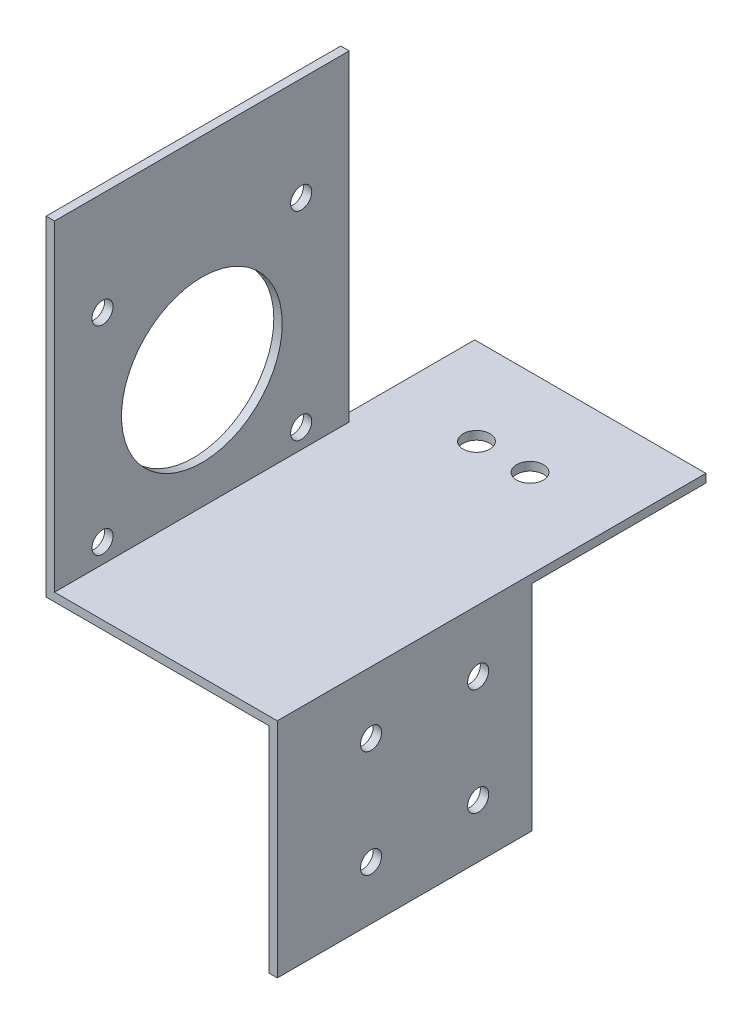
ISO-10303-21;
HEADER;
FILE_DESCRIPTION(('STEP AP214'),'2;1');
FILE_NAME('part.step','',(''),(''),'','','');
FILE_SCHEMA(('AUTOMOTIVE_DESIGN { 1 0 10303 214 1 1 1 1 }'));
ENDSEC;
DATA;
#1=APPLICATION_CONTEXT('core data for automotive mechanical design processes');
#2=APPLICATION_PROTOCOL_DEFINITION('international standard','automotive_design',2000,#1);
#3=PRODUCT_CONTEXT('',#1,'mechanical');
#4=PRODUCT('Part','Part','',(#3));
#5=PRODUCT_RELATED_PRODUCT_CATEGORY('part','',(#4));
#6=PRODUCT_DEFINITION_FORMATION('','',#4);
#7=PRODUCT_DEFINITION_CONTEXT('part definition',#1,'design');
#8=PRODUCT_DEFINITION('design','',#6,#7);
#9=PRODUCT_DEFINITION_SHAPE('','',#8);
#10=(LENGTH_UNIT() NAMED_UNIT(*) SI_UNIT(.MILLI.,.METRE.));
#11=(NAMED_UNIT(*) PLANE_ANGLE_UNIT() SI_UNIT($,.RADIAN.));
#12=(NAMED_UNIT(*) SI_UNIT($,.STERADIAN.) SOLID_ANGLE_UNIT());
#13=UNCERTAINTY_MEASURE_WITH_UNIT(LENGTH_MEASURE(1.E-05),#10,'distance_accuracy_value','');
#14=(GEOMETRIC_REPRESENTATION_CONTEXT(3) GLOBAL_UNCERTAINTY_ASSIGNED_CONTEXT((#13)) GLOBAL_UNIT_ASSIGNED_CONTEXT((#10,
#11,#12)) REPRESENTATION_CONTEXT('',''));
#15=CARTESIAN_POINT('',(0.,0.,0.));
#16=DIRECTION('',(0.,0.,1.));
#17=DIRECTION('',(1.,0.,0.));
#18=AXIS2_PLACEMENT_3D('',#15,#16,#17);
#19=CARTESIAN_POINT('',(-76.2,27.4,-25.4));
#20=DIRECTION('',(0.,0.,1.));
#21=DIRECTION('',(0.,-1.,0.));
#22=AXIS2_PLACEMENT_3D('',#19,#20,#21);
#23=PLANE('',#22);
#24=DIRECTION('',(-1.,0.,0.));
#25=VECTOR('',#24,1.);
#26=CARTESIAN_POINT('',(0.,25.4,-25.4));
#27=LINE('',#26,#25);
#28=CARTESIAN_POINT('',(0.,25.4,-25.4));
#29=VERTEX_POINT('',#28);
#30=CARTESIAN_POINT('',(-2.,25.4,-25.4));
#31=VERTEX_POINT('',#30);
#32=EDGE_CURVE('E57',#29,#31,#27,.T.);
#33=ORIENTED_EDGE('',*,*,#32,.F.);
#34=DIRECTION('',(0.,-1.,0.));
#35=VECTOR('',#34,1.);
#36=CARTESIAN_POINT('',(0.,27.4,-25.4));
#37=LINE('',#36,#35);
#38=CARTESIAN_POINT('',(0.,-25.4,-25.4));
#39=VERTEX_POINT('',#38);
#40=EDGE_CURVE('E142',#29,#39,#37,.T.);
#41=ORIENTED_EDGE('',*,*,#40,.T.);
#42=DIRECTION('',(1.,0.,0.));
#43=VECTOR('',#42,1.);
#44=CARTESIAN_POINT('',(-76.2,-25.4,-25.4));
#45=LINE('',#44,#43);
#46=CARTESIAN_POINT('',(-2.00000000000003,-25.4,-25.4));
#47=VERTEX_POINT('',#46);
#48=EDGE_CURVE('E160',#47,#39,#45,.T.);
#49=ORIENTED_EDGE('',*,*,#48,.F.);
#50=DIRECTION('',(0.,1.,0.));
#51=VECTOR('',#50,1.);
#52=CARTESIAN_POINT('',(-2.,0.,-25.4));
#53=LINE('',#52,#51);
#54=EDGE_CURVE('E164',#47,#31,#53,.T.);
#55=ORIENTED_EDGE('',*,*,#54,.T.);
#56=EDGE_LOOP('',(#33,#41,#49,#55));
#57=FACE_BOUND('',#56,.T.);
#58=ADVANCED_FACE('F39',(#57),#23,.F.);
#59=CARTESIAN_POINT('',(0.,27.4,0.));
#60=DIRECTION('',(0.,-1.,0.));
#61=DIRECTION('',(0.,0.,-1.));
#62=AXIS2_PLACEMENT_3D('',#59,#60,#61);
#63=PLANE('',#62);
#64=CARTESIAN_POINT('',(-33.75,27.4,-46.0375));
#65=DIRECTION('',(0.,1.,0.));
#66=DIRECTION('',(0.,0.,1.));
#67=AXIS2_PLACEMENT_3D('',#64,#65,#66);
#68=CIRCLE('',#67,3.175);
#69=CARTESIAN_POINT('',(-33.75,27.4,-42.8625));
#70=VERTEX_POINT('',#69);
#71=EDGE_CURVE('E298',#70,#70,#68,.T.);
#72=ORIENTED_EDGE('',*,*,#71,.F.);
#73=EDGE_LOOP('',(#72));
#74=FACE_BOUND('',#73,.T.);
#75=CARTESIAN_POINT('',(-21.05,27.4,-46.0375));
#76=DIRECTION('',(0.,1.,0.));
#77=DIRECTION('',(0.,0.,1.));
#78=AXIS2_PLACEMENT_3D('',#75,#76,#77);
#79=CIRCLE('',#78,3.175);
#80=CARTESIAN_POINT('',(-21.05,27.4,-42.8625));
#81=VERTEX_POINT('',#80);
#82=EDGE_CURVE('E305',#81,#81,#79,.T.);
#83=ORIENTED_EDGE('',*,*,#82,.F.);
#84=EDGE_LOOP('',(#83));
#85=FACE_BOUND('',#84,.T.);
#86=DIRECTION('',(0.,0.,-1.));
#87=VECTOR('',#86,1.);
#88=CARTESIAN_POINT('',(0.,27.4,-34.925));
#89=LINE('',#88,#87);
#90=CARTESIAN_POINT('',(0.,27.4,34.925));
#91=VERTEX_POINT('',#90);
#92=CARTESIAN_POINT('',(0.,27.4,-66.675));
#93=VERTEX_POINT('',#92);
#94=EDGE_CURVE('E259',#91,#93,#89,.T.);
#95=ORIENTED_EDGE('',*,*,#94,.T.);
#96=DIRECTION('',(1.,0.,0.));
#97=VECTOR('',#96,1.);
#98=CARTESIAN_POINT('',(0.,27.4,-66.675));
#99=LINE('',#98,#97);
#100=CARTESIAN_POINT('',(-54.8,27.4,-66.675));
#101=VERTEX_POINT('',#100);
#102=EDGE_CURVE('E135',#101,#93,#99,.T.);
#103=ORIENTED_EDGE('',*,*,#102,.F.);
#104=DIRECTION('',(0.,0.,1.));
#105=VECTOR('',#104,1.);
#106=CARTESIAN_POINT('',(-54.8,27.4,-66.675));
#107=LINE('',#106,#105);
#108=CARTESIAN_POINT('',(-54.8,27.4,-34.925));
#109=VERTEX_POINT('',#108);
#110=EDGE_CURVE('E145',#101,#109,#107,.T.);
#111=ORIENTED_EDGE('',*,*,#110,.T.);
#112=DIRECTION('',(1.,0.,0.));
#113=VECTOR('',#112,1.);
#114=CARTESIAN_POINT('',(-76.2,27.4,-34.925));
#115=LINE('',#114,#113);
#116=CARTESIAN_POINT('',(-52.8,27.4,-34.925));
#117=VERTEX_POINT('',#116);
#118=EDGE_CURVE('E158',#109,#117,#115,.T.);
#119=ORIENTED_EDGE('',*,*,#118,.T.);
#120=DIRECTION('',(0.,0.,-1.));
#121=VECTOR('',#120,1.);
#122=CARTESIAN_POINT('',(-52.8,27.4,-34.925));
#123=LINE('',#122,#121);
#124=CARTESIAN_POINT('',(-52.8,27.4,34.925));
#125=VERTEX_POINT('',#124);
#126=EDGE_CURVE('E65',#125,#117,#123,.T.);
#127=ORIENTED_EDGE('',*,*,#126,.F.);
#128=DIRECTION('',(1.,0.,0.));
#129=VECTOR('',#128,1.);
#130=CARTESIAN_POINT('',(0.,27.4,34.925));
#131=LINE('',#130,#129);
#132=EDGE_CURVE('E262',#125,#91,#131,.T.);
#133=ORIENTED_EDGE('',*,*,#132,.T.);
#134=EDGE_LOOP('',(#95,#103,#111,#119,#127,#133));
#135=FACE_BOUND('',#134,.T.);
#136=ADVANCED_FACE('F333',(#74,#85,#135),#63,.F.);
#137=CARTESIAN_POINT('',(-2.,-25.4,-34.925));
#138=DIRECTION('',(0.,0.,-1.));
#139=DIRECTION('',(-1.,0.,0.));
#140=AXIS2_PLACEMENT_3D('',#137,#138,#139);
#141=PLANE('',#140);
#142=ORIENTED_EDGE('',*,*,#118,.F.);
#143=DIRECTION('',(0.,-1.,0.));
#144=VECTOR('',#143,1.);
#145=CARTESIAN_POINT('',(-54.8,27.4,-34.925));
#146=LINE('',#145,#144);
#147=CARTESIAN_POINT('',(-54.8,103.6,-34.925));
#148=VERTEX_POINT('',#147);
#149=EDGE_CURVE('E275',#148,#109,#146,.T.);
#150=ORIENTED_EDGE('',*,*,#149,.F.);
#151=DIRECTION('',(-1.,0.,0.));
#152=VECTOR('',#151,1.);
#153=CARTESIAN_POINT('',(-54.8,103.6,-34.925));
#154=LINE('',#153,#152);
#155=CARTESIAN_POINT('',(-52.8,103.6,-34.925));
#156=VERTEX_POINT('',#155);
#157=EDGE_CURVE('E245',#156,#148,#154,.T.);
#158=ORIENTED_EDGE('',*,*,#157,.F.);
#159=DIRECTION('',(0.,-1.,0.));
#160=VECTOR('',#159,1.);
#161=CARTESIAN_POINT('',(-52.8,103.6,-34.925));
#162=LINE('',#161,#160);
#163=EDGE_CURVE('E249',#156,#117,#162,.T.);
#164=ORIENTED_EDGE('',*,*,#163,.T.);
#165=EDGE_LOOP('',(#142,#150,#158,#164));
#166=FACE_BOUND('',#165,.T.);
#167=ADVANCED_FACE('F41',(#166),#141,.T.);
#168=CARTESIAN_POINT('',(-2.,-25.4,34.925));
#169=DIRECTION('',(0.,-1.,0.));
#170=DIRECTION('',(0.,0.,-1.));
#171=AXIS2_PLACEMENT_3D('',#168,#169,#170);
#172=PLANE('',#171);
#173=ORIENTED_EDGE('',*,*,#48,.T.);
#174=DIRECTION('',(0.,0.,-1.));
#175=VECTOR('',#174,1.);
#176=CARTESIAN_POINT('',(0.,-25.4,34.925));
#177=LINE('',#176,#175);
#178=CARTESIAN_POINT('',(0.,-25.4,34.925));
#179=VERTEX_POINT('',#178);
#180=EDGE_CURVE('E284',#179,#39,#177,.T.);
#181=ORIENTED_EDGE('',*,*,#180,.F.);
#182=DIRECTION('',(1.,0.,0.));
#183=VECTOR('',#182,1.);
#184=CARTESIAN_POINT('',(-2.,-25.4,34.925));
#185=LINE('',#184,#183);
#186=CARTESIAN_POINT('',(-2.,-25.4,34.925));
#187=VERTEX_POINT('',#186);
#188=EDGE_CURVE('E11',#187,#179,#185,.T.);
#189=ORIENTED_EDGE('',*,*,#188,.F.);
#190=DIRECTION('',(0.,0.,-1.));
#191=VECTOR('',#190,1.);
#192=CARTESIAN_POINT('',(-2.,-25.4,34.925));
#193=LINE('',#192,#191);
#194=EDGE_CURVE('E49',#187,#47,#193,.T.);
#195=ORIENTED_EDGE('',*,*,#194,.T.);
#196=EDGE_LOOP('',(#173,#181,#189,#195));
#197=FACE_BOUND('',#196,.T.);
#198=ADVANCED_FACE('F336',(#197),#172,.T.);
#199=CARTESIAN_POINT('',(-2.,-25.4,34.925));
#200=DIRECTION('',(0.,0.,1.));
#201=DIRECTION('',(1.,0.,0.));
#202=AXIS2_PLACEMENT_3D('',#199,#200,#201);
#203=PLANE('',#202);
#204=DIRECTION('',(0.,-1.,0.));
#205=VECTOR('',#204,1.);
#206=CARTESIAN_POINT('',(0.,-25.4,34.925));
#207=LINE('',#206,#205);
#208=EDGE_CURVE('E279',#91,#179,#207,.T.);
#209=ORIENTED_EDGE('',*,*,#208,.F.);
#210=ORIENTED_EDGE('',*,*,#132,.F.);
#211=DIRECTION('',(0.,-1.,0.));
#212=VECTOR('',#211,1.);
#213=CARTESIAN_POINT('',(-52.8,103.6,34.925));
#214=LINE('',#213,#212);
#215=CARTESIAN_POINT('',(-52.8,103.6,34.925));
#216=VERTEX_POINT('',#215);
#217=EDGE_CURVE('E255',#216,#125,#214,.T.);
#218=ORIENTED_EDGE('',*,*,#217,.F.);
#219=DIRECTION('',(1.,0.,0.));
#220=VECTOR('',#219,1.);
#221=CARTESIAN_POINT('',(-54.8,103.6,34.925));
#222=LINE('',#221,#220);
#223=CARTESIAN_POINT('',(-54.8,103.6,34.925));
#224=VERTEX_POINT('',#223);
#225=EDGE_CURVE('E239',#224,#216,#222,.T.);
#226=ORIENTED_EDGE('',*,*,#225,.F.);
#227=DIRECTION('',(0.,-1.,0.));
#228=VECTOR('',#227,1.);
#229=CARTESIAN_POINT('',(-54.8,27.4,34.925));
#230=LINE('',#229,#228);
#231=CARTESIAN_POINT('',(-54.8,25.4,34.925));
#232=VERTEX_POINT('',#231);
#233=EDGE_CURVE('E266',#224,#232,#230,.T.);
#234=ORIENTED_EDGE('',*,*,#233,.T.);
#235=DIRECTION('',(1.,0.,0.));
#236=VECTOR('',#235,1.);
#237=CARTESIAN_POINT('',(0.,25.4,34.925));
#238=LINE('',#237,#236);
#239=CARTESIAN_POINT('',(-2.,25.4,34.925));
#240=VERTEX_POINT('',#239);
#241=EDGE_CURVE('E263',#232,#240,#238,.T.);
#242=ORIENTED_EDGE('',*,*,#241,.T.);
#243=DIRECTION('',(0.,-1.,0.));
#244=VECTOR('',#243,1.);
#245=CARTESIAN_POINT('',(-2.,-25.4,34.925));
#246=LINE('',#245,#244);
#247=EDGE_CURVE('E283',#240,#187,#246,.T.);
#248=ORIENTED_EDGE('',*,*,#247,.T.);
#249=ORIENTED_EDGE('',*,*,#188,.T.);
#250=EDGE_LOOP('',(#209,#210,#218,#226,#234,#242,#248,#249));
#251=FACE_BOUND('',#250,.T.);
#252=ADVANCED_FACE('F326',(#251),#203,.T.);
#253=CARTESIAN_POINT('',(-2.,0.,0.));
#254=DIRECTION('',(-1.,0.,0.));
#255=DIRECTION('',(0.,0.,1.));
#256=AXIS2_PLACEMENT_3D('',#253,#254,#255);
#257=PLANE('',#256);
#258=ORIENTED_EDGE('',*,*,#54,.F.);
#259=ORIENTED_EDGE('',*,*,#194,.F.);
#260=ORIENTED_EDGE('',*,*,#247,.F.);
#261=DIRECTION('',(0.,0.,1.));
#262=VECTOR('',#261,1.);
#263=CARTESIAN_POINT('',(-2.,25.4,34.925));
#264=LINE('',#263,#262);
#265=EDGE_CURVE('E280',#31,#240,#264,.T.);
#266=ORIENTED_EDGE('',*,*,#265,.F.);
#267=EDGE_LOOP('',(#258,#259,#260,#266));
#268=FACE_BOUND('',#267,.T.);
#269=CARTESIAN_POINT('',(-2.,12.7,12.7));
#270=DIRECTION('',(-1.,0.,0.));
#271=DIRECTION('',(0.,0.,1.));
#272=AXIS2_PLACEMENT_3D('',#269,#270,#271);
#273=CIRCLE('',#272,2.5);
#274=CARTESIAN_POINT('',(-2.,12.7,10.2));
#275=VERTEX_POINT('',#274);
#276=EDGE_CURVE('E191',#275,#275,#273,.T.);
#277=ORIENTED_EDGE('',*,*,#276,.F.);
#278=EDGE_LOOP('',(#277));
#279=FACE_BOUND('',#278,.T.);
#280=CARTESIAN_POINT('',(-2.,12.7,-12.7));
#281=DIRECTION('',(-1.,0.,0.));
#282=DIRECTION('',(0.,0.,1.));
#283=AXIS2_PLACEMENT_3D('',#280,#281,#282);
#284=CIRCLE('',#283,2.5);
#285=CARTESIAN_POINT('',(-2.,12.7,-15.2));
#286=VERTEX_POINT('',#285);
#287=EDGE_CURVE('E187',#286,#286,#284,.T.);
#288=ORIENTED_EDGE('',*,*,#287,.F.);
#289=EDGE_LOOP('',(#288));
#290=FACE_BOUND('',#289,.T.);
#291=CARTESIAN_POINT('',(-2.,-12.7,-12.7));
#292=DIRECTION('',(-1.,0.,0.));
#293=DIRECTION('',(0.,0.,1.));
#294=AXIS2_PLACEMENT_3D('',#291,#292,#293);
#295=CIRCLE('',#294,2.5);
#296=CARTESIAN_POINT('',(-2.,-12.7,-15.2));
#297=VERTEX_POINT('',#296);
#298=EDGE_CURVE('E183',#297,#297,#295,.T.);
#299=ORIENTED_EDGE('',*,*,#298,.F.);
#300=EDGE_LOOP('',(#299));
#301=FACE_BOUND('',#300,.T.);
#302=CARTESIAN_POINT('',(-2.,-12.7,12.7));
#303=DIRECTION('',(-1.,0.,0.));
#304=DIRECTION('',(0.,0.,1.));
#305=AXIS2_PLACEMENT_3D('',#302,#303,#304);
#306=CIRCLE('',#305,2.5);
#307=CARTESIAN_POINT('',(-2.,-12.7,10.2));
#308=VERTEX_POINT('',#307);
#309=EDGE_CURVE('E179',#308,#308,#306,.T.);
#310=ORIENTED_EDGE('',*,*,#309,.F.);
#311=EDGE_LOOP('',(#310));
#312=FACE_BOUND('',#311,.T.);
#313=ADVANCED_FACE('F322',(#268,#279,#290,#301,#312),#257,.T.);
#314=CARTESIAN_POINT('',(0.,0.,0.));
#315=DIRECTION('',(-1.,0.,0.));
#316=DIRECTION('',(0.,0.,1.));
#317=AXIS2_PLACEMENT_3D('',#314,#315,#316);
#318=PLANE('',#317);
#319=CARTESIAN_POINT('',(0.,12.7,12.7));
#320=DIRECTION('',(1.,0.,0.));
#321=DIRECTION('',(0.,0.,-1.));
#322=AXIS2_PLACEMENT_3D('',#319,#320,#321);
#323=CIRCLE('',#322,2.5);
#324=CARTESIAN_POINT('',(0.,12.7,10.2));
#325=VERTEX_POINT('',#324);
#326=EDGE_CURVE('E159',#325,#325,#323,.T.);
#327=ORIENTED_EDGE('',*,*,#326,.F.);
#328=EDGE_LOOP('',(#327));
#329=FACE_BOUND('',#328,.T.);
#330=CARTESIAN_POINT('',(0.,12.7,-12.7));
#331=DIRECTION('',(1.,0.,0.));
#332=DIRECTION('',(0.,0.,-1.));
#333=AXIS2_PLACEMENT_3D('',#330,#331,#332);
#334=CIRCLE('',#333,2.5);
#335=CARTESIAN_POINT('',(0.,12.7,-15.2));
#336=VERTEX_POINT('',#335);
#337=EDGE_CURVE('E170',#336,#336,#334,.T.);
#338=ORIENTED_EDGE('',*,*,#337,.F.);
#339=EDGE_LOOP('',(#338));
#340=FACE_BOUND('',#339,.T.);
#341=CARTESIAN_POINT('',(0.,-12.7,-12.7));
#342=DIRECTION('',(1.,0.,0.));
#343=DIRECTION('',(0.,0.,-1.));
#344=AXIS2_PLACEMENT_3D('',#341,#342,#343);
#345=CIRCLE('',#344,2.5);
#346=CARTESIAN_POINT('',(0.,-12.7,-15.2));
#347=VERTEX_POINT('',#346);
#348=EDGE_CURVE('E150',#347,#347,#345,.T.);
#349=ORIENTED_EDGE('',*,*,#348,.F.);
#350=EDGE_LOOP('',(#349));
#351=FACE_BOUND('',#350,.T.);
#352=CARTESIAN_POINT('',(0.,-12.7,12.7));
#353=DIRECTION('',(1.,0.,0.));
#354=DIRECTION('',(0.,0.,-1.));
#355=AXIS2_PLACEMENT_3D('',#352,#353,#354);
#356=CIRCLE('',#355,2.5);
#357=CARTESIAN_POINT('',(0.,-12.7,10.2));
#358=VERTEX_POINT('',#357);
#359=EDGE_CURVE('E144',#358,#358,#356,.T.);
#360=ORIENTED_EDGE('',*,*,#359,.F.);
#361=EDGE_LOOP('',(#360));
#362=FACE_BOUND('',#361,.T.);
#363=ORIENTED_EDGE('',*,*,#180,.T.);
#364=ORIENTED_EDGE('',*,*,#40,.F.);
#365=DIRECTION('',(0.,0.,1.));
#366=VECTOR('',#365,1.);
#367=CARTESIAN_POINT('',(0.,25.4,-66.675));
#368=LINE('',#367,#366);
#369=CARTESIAN_POINT('',(0.,25.4,-66.675));
#370=VERTEX_POINT('',#369);
#371=EDGE_CURVE('E122',#370,#29,#368,.T.);
#372=ORIENTED_EDGE('',*,*,#371,.F.);
#373=DIRECTION('',(0.,-1.,0.));
#374=VECTOR('',#373,1.);
#375=CARTESIAN_POINT('',(0.,27.4,-66.675));
#376=LINE('',#375,#374);
#377=EDGE_CURVE('E129',#93,#370,#376,.T.);
#378=ORIENTED_EDGE('',*,*,#377,.F.);
#379=ORIENTED_EDGE('',*,*,#94,.F.);
#380=ORIENTED_EDGE('',*,*,#208,.T.);
#381=EDGE_LOOP('',(#363,#364,#372,#378,#379,#380));
#382=FACE_BOUND('',#381,.T.);
#383=ADVANCED_FACE('F141',(#329,#340,#351,#362,#382),#318,.F.);
#384=CARTESIAN_POINT('',(-54.8,27.4,-34.925));
#385=DIRECTION('',(1.,0.,0.));
#386=DIRECTION('',(0.,0.,-1.));
#387=AXIS2_PLACEMENT_3D('',#384,#385,#386);
#388=PLANE('',#387);
#389=CARTESIAN_POINT('',(-54.8,32.0179581789407,-23.55));
#390=DIRECTION('',(1.,0.,0.));
#391=DIRECTION('',(0.,0.,-1.));
#392=AXIS2_PLACEMENT_3D('',#389,#390,#391);
#393=CIRCLE('',#392,2.5);
#394=CARTESIAN_POINT('',(-54.8,32.0179581789407,-26.05));
#395=VERTEX_POINT('',#394);
#396=EDGE_CURVE('E221',#395,#395,#393,.T.);
#397=ORIENTED_EDGE('',*,*,#396,.T.);
#398=EDGE_LOOP('',(#397));
#399=FACE_BOUND('',#398,.T.);
#400=CARTESIAN_POINT('',(-54.8,32.0179581789407,23.55));
#401=DIRECTION('',(1.,0.,0.));
#402=DIRECTION('',(0.,0.,-1.));
#403=AXIS2_PLACEMENT_3D('',#400,#401,#402);
#404=CIRCLE('',#403,2.5);
#405=CARTESIAN_POINT('',(-54.8,32.0179581789407,21.05));
#406=VERTEX_POINT('',#405);
#407=EDGE_CURVE('E213',#406,#406,#404,.T.);
#408=ORIENTED_EDGE('',*,*,#407,.T.);
#409=EDGE_LOOP('',(#408));
#410=FACE_BOUND('',#409,.T.);
#411=CARTESIAN_POINT('',(-54.8,79.1179581789407,23.55));
#412=DIRECTION('',(1.,0.,0.));
#413=DIRECTION('',(0.,0.,-1.));
#414=AXIS2_PLACEMENT_3D('',#411,#412,#413);
#415=CIRCLE('',#414,2.5);
#416=CARTESIAN_POINT('',(-54.8,79.1179581789407,21.05));
#417=VERTEX_POINT('',#416);
#418=EDGE_CURVE('E205',#417,#417,#415,.T.);
#419=ORIENTED_EDGE('',*,*,#418,.T.);
#420=EDGE_LOOP('',(#419));
#421=FACE_BOUND('',#420,.T.);
#422=CARTESIAN_POINT('',(-54.8,79.1179581789407,-23.55));
#423=DIRECTION('',(1.,0.,0.));
#424=DIRECTION('',(0.,0.,-1.));
#425=AXIS2_PLACEMENT_3D('',#422,#423,#424);
#426=CIRCLE('',#425,2.5);
#427=CARTESIAN_POINT('',(-54.8,79.1179581789407,-26.05));
#428=VERTEX_POINT('',#427);
#429=EDGE_CURVE('E196',#428,#428,#426,.T.);
#430=ORIENTED_EDGE('',*,*,#429,.T.);
#431=EDGE_LOOP('',(#430));
#432=FACE_BOUND('',#431,.T.);
#433=CARTESIAN_POINT('',(-54.8,55.5679581789407,0.));
#434=DIRECTION('',(1.,0.,0.));
#435=DIRECTION('',(0.,0.,-1.));
#436=AXIS2_PLACEMENT_3D('',#433,#434,#435);
#437=CIRCLE('',#436,19.05);
#438=CARTESIAN_POINT('',(-54.8,55.5679581789407,-19.05));
#439=VERTEX_POINT('',#438);
#440=EDGE_CURVE('E228',#439,#439,#437,.T.);
#441=ORIENTED_EDGE('',*,*,#440,.T.);
#442=EDGE_LOOP('',(#441));
#443=FACE_BOUND('',#442,.T.);
#444=ORIENTED_EDGE('',*,*,#149,.T.);
#445=ORIENTED_EDGE('',*,*,#110,.F.);
#446=DIRECTION('',(0.,1.,0.));
#447=VECTOR('',#446,1.);
#448=CARTESIAN_POINT('',(-54.8,27.4,-66.675));
#449=LINE('',#448,#447);
#450=CARTESIAN_POINT('',(-54.8,25.4,-66.675));
#451=VERTEX_POINT('',#450);
#452=EDGE_CURVE('E128',#451,#101,#449,.T.);
#453=ORIENTED_EDGE('',*,*,#452,.F.);
#454=DIRECTION('',(0.,0.,1.));
#455=VECTOR('',#454,1.);
#456=CARTESIAN_POINT('',(-54.8,25.4,-34.925));
#457=LINE('',#456,#455);
#458=EDGE_CURVE('E124',#451,#232,#457,.T.);
#459=ORIENTED_EDGE('',*,*,#458,.T.);
#460=ORIENTED_EDGE('',*,*,#233,.F.);
#461=DIRECTION('',(0.,0.,1.));
#462=VECTOR('',#461,1.);
#463=CARTESIAN_POINT('',(-54.8,103.6,-34.925));
#464=LINE('',#463,#462);
#465=EDGE_CURVE('E235',#148,#224,#464,.T.);
#466=ORIENTED_EDGE('',*,*,#465,.F.);
#467=EDGE_LOOP('',(#444,#445,#453,#459,#460,#466));
#468=FACE_BOUND('',#467,.T.);
#469=ADVANCED_FACE('F331',(#399,#410,#421,#432,#443,#468),#388,.F.);
#470=CARTESIAN_POINT('',(0.,25.4,0.));
#471=DIRECTION('',(0.,-1.,0.));
#472=DIRECTION('',(0.,0.,-1.));
#473=AXIS2_PLACEMENT_3D('',#470,#471,#472);
#474=PLANE('',#473);
#475=CARTESIAN_POINT('',(-33.75,25.4,-46.0375));
#476=DIRECTION('',(0.,-1.,0.));
#477=DIRECTION('',(0.,0.,-1.));
#478=AXIS2_PLACEMENT_3D('',#475,#476,#477);
#479=CIRCLE('',#478,3.175);
#480=CARTESIAN_POINT('',(-33.75,25.4,-49.2125));
#481=VERTEX_POINT('',#480);
#482=EDGE_CURVE('E43',#481,#481,#479,.T.);
#483=ORIENTED_EDGE('',*,*,#482,.F.);
#484=EDGE_LOOP('',(#483));
#485=FACE_BOUND('',#484,.T.);
#486=CARTESIAN_POINT('',(-21.05,25.4,-46.0375));
#487=DIRECTION('',(0.,-1.,0.));
#488=DIRECTION('',(0.,0.,-1.));
#489=AXIS2_PLACEMENT_3D('',#486,#487,#488);
#490=CIRCLE('',#489,3.175);
#491=CARTESIAN_POINT('',(-21.05,25.4,-49.2125));
#492=VERTEX_POINT('',#491);
#493=EDGE_CURVE('E295',#492,#492,#490,.T.);
#494=ORIENTED_EDGE('',*,*,#493,.F.);
#495=EDGE_LOOP('',(#494));
#496=FACE_BOUND('',#495,.T.);
#497=ORIENTED_EDGE('',*,*,#458,.F.);
#498=DIRECTION('',(-1.,0.,0.));
#499=VECTOR('',#498,1.);
#500=CARTESIAN_POINT('',(0.,25.4,-66.675));
#501=LINE('',#500,#499);
#502=EDGE_CURVE('E118',#370,#451,#501,.T.);
#503=ORIENTED_EDGE('',*,*,#502,.F.);
#504=ORIENTED_EDGE('',*,*,#371,.T.);
#505=ORIENTED_EDGE('',*,*,#32,.T.);
#506=ORIENTED_EDGE('',*,*,#265,.T.);
#507=ORIENTED_EDGE('',*,*,#241,.F.);
#508=EDGE_LOOP('',(#497,#503,#504,#505,#506,#507));
#509=FACE_BOUND('',#508,.T.);
#510=ADVANCED_FACE('F120',(#485,#496,#509),#474,.T.);
#511=CARTESIAN_POINT('',(-52.8,103.6,-34.925));
#512=DIRECTION('',(-1.,0.,0.));
#513=DIRECTION('',(0.,0.,1.));
#514=AXIS2_PLACEMENT_3D('',#511,#512,#513);
#515=PLANE('',#514);
#516=CARTESIAN_POINT('',(-52.8,32.0179581789407,-23.55));
#517=DIRECTION('',(1.,0.,0.));
#518=DIRECTION('',(0.,0.,-1.));
#519=AXIS2_PLACEMENT_3D('',#516,#517,#518);
#520=CIRCLE('',#519,2.5);
#521=CARTESIAN_POINT('',(-52.8,32.0179581789407,-26.05));
#522=VERTEX_POINT('',#521);
#523=EDGE_CURVE('E195',#522,#522,#520,.T.);
#524=ORIENTED_EDGE('',*,*,#523,.F.);
#525=EDGE_LOOP('',(#524));
#526=FACE_BOUND('',#525,.T.);
#527=CARTESIAN_POINT('',(-52.8,32.0179581789407,23.55));
#528=DIRECTION('',(1.,0.,0.));
#529=DIRECTION('',(0.,0.,-1.));
#530=AXIS2_PLACEMENT_3D('',#527,#528,#529);
#531=CIRCLE('',#530,2.5);
#532=CARTESIAN_POINT('',(-52.8,32.0179581789407,21.05));
#533=VERTEX_POINT('',#532);
#534=EDGE_CURVE('E217',#533,#533,#531,.T.);
#535=ORIENTED_EDGE('',*,*,#534,.F.);
#536=EDGE_LOOP('',(#535));
#537=FACE_BOUND('',#536,.T.);
#538=CARTESIAN_POINT('',(-52.8,79.1179581789407,23.55));
#539=DIRECTION('',(1.,0.,0.));
#540=DIRECTION('',(0.,0.,-1.));
#541=AXIS2_PLACEMENT_3D('',#538,#539,#540);
#542=CIRCLE('',#541,2.5);
#543=CARTESIAN_POINT('',(-52.8,79.1179581789407,21.05));
#544=VERTEX_POINT('',#543);
#545=EDGE_CURVE('E209',#544,#544,#542,.T.);
#546=ORIENTED_EDGE('',*,*,#545,.F.);
#547=EDGE_LOOP('',(#546));
#548=FACE_BOUND('',#547,.T.);
#549=CARTESIAN_POINT('',(-52.8,79.1179581789407,-23.55));
#550=DIRECTION('',(1.,0.,0.));
#551=DIRECTION('',(0.,0.,-1.));
#552=AXIS2_PLACEMENT_3D('',#549,#550,#551);
#553=CIRCLE('',#552,2.5);
#554=CARTESIAN_POINT('',(-52.8,79.1179581789407,-26.05));
#555=VERTEX_POINT('',#554);
#556=EDGE_CURVE('E201',#555,#555,#553,.T.);
#557=ORIENTED_EDGE('',*,*,#556,.F.);
#558=EDGE_LOOP('',(#557));
#559=FACE_BOUND('',#558,.T.);
#560=CARTESIAN_POINT('',(-52.8,55.5679581789407,0.));
#561=DIRECTION('',(1.,0.,0.));
#562=DIRECTION('',(0.,0.,-1.));
#563=AXIS2_PLACEMENT_3D('',#560,#561,#562);
#564=CIRCLE('',#563,19.05);
#565=CARTESIAN_POINT('',(-52.8,55.5679581789407,-19.05));
#566=VERTEX_POINT('',#565);
#567=EDGE_CURVE('E200',#566,#566,#564,.T.);
#568=ORIENTED_EDGE('',*,*,#567,.F.);
#569=EDGE_LOOP('',(#568));
#570=FACE_BOUND('',#569,.T.);
#571=ORIENTED_EDGE('',*,*,#126,.T.);
#572=ORIENTED_EDGE('',*,*,#163,.F.);
#573=DIRECTION('',(0.,0.,-1.));
#574=VECTOR('',#573,1.);
#575=CARTESIAN_POINT('',(-52.8,103.6,-34.925));
#576=LINE('',#575,#574);
#577=EDGE_CURVE('E242',#216,#156,#576,.T.);
#578=ORIENTED_EDGE('',*,*,#577,.F.);
#579=ORIENTED_EDGE('',*,*,#217,.T.);
#580=EDGE_LOOP('',(#571,#572,#578,#579));
#581=FACE_BOUND('',#580,.T.);
#582=ADVANCED_FACE('F386',(#526,#537,#548,#559,#570,#581),#515,.F.);
#583=CARTESIAN_POINT('',(0.,103.6,0.));
#584=DIRECTION('',(0.,1.,0.));
#585=DIRECTION('',(0.,0.,1.));
#586=AXIS2_PLACEMENT_3D('',#583,#584,#585);
#587=PLANE('',#586);
#588=ORIENTED_EDGE('',*,*,#465,.T.);
#589=ORIENTED_EDGE('',*,*,#225,.T.);
#590=ORIENTED_EDGE('',*,*,#577,.T.);
#591=ORIENTED_EDGE('',*,*,#157,.T.);
#592=EDGE_LOOP('',(#588,#589,#590,#591));
#593=FACE_BOUND('',#592,.T.);
#594=ADVANCED_FACE('F382',(#593),#587,.T.);
#595=CARTESIAN_POINT('',(-54.8,55.5679581789407,0.));
#596=DIRECTION('',(1.,0.,0.));
#597=DIRECTION('',(0.,0.,-1.));
#598=AXIS2_PLACEMENT_3D('',#595,#596,#597);
#599=CYLINDRICAL_SURFACE('',#598,19.05);
#600=ORIENTED_EDGE('',*,*,#440,.F.);
#601=EDGE_LOOP('',(#600));
#602=FACE_BOUND('',#601,.T.);
#603=ORIENTED_EDGE('',*,*,#567,.T.);
#604=EDGE_LOOP('',(#603));
#605=FACE_BOUND('',#604,.T.);
#606=ADVANCED_FACE('F368',(#602,#605),#599,.F.);
#607=CARTESIAN_POINT('',(-54.8,79.1179581789407,-23.55));
#608=DIRECTION('',(1.,0.,0.));
#609=DIRECTION('',(0.,0.,-1.));
#610=AXIS2_PLACEMENT_3D('',#607,#608,#609);
#611=CYLINDRICAL_SURFACE('',#610,2.5);
#612=ORIENTED_EDGE('',*,*,#429,.F.);
#613=EDGE_LOOP('',(#612));
#614=FACE_BOUND('',#613,.T.);
#615=ORIENTED_EDGE('',*,*,#556,.T.);
#616=EDGE_LOOP('',(#615));
#617=FACE_BOUND('',#616,.T.);
#618=ADVANCED_FACE('F364',(#614,#617),#611,.F.);
#619=CARTESIAN_POINT('',(-54.8,79.1179581789407,23.55));
#620=DIRECTION('',(1.,0.,0.));
#621=DIRECTION('',(0.,0.,-1.));
#622=AXIS2_PLACEMENT_3D('',#619,#620,#621);
#623=CYLINDRICAL_SURFACE('',#622,2.5);
#624=ORIENTED_EDGE('',*,*,#418,.F.);
#625=EDGE_LOOP('',(#624));
#626=FACE_BOUND('',#625,.T.);
#627=ORIENTED_EDGE('',*,*,#545,.T.);
#628=EDGE_LOOP('',(#627));
#629=FACE_BOUND('',#628,.T.);
#630=ADVANCED_FACE('F367',(#626,#629),#623,.F.);
#631=CARTESIAN_POINT('',(-54.8,32.0179581789407,23.55));
#632=DIRECTION('',(1.,0.,0.));
#633=DIRECTION('',(0.,0.,-1.));
#634=AXIS2_PLACEMENT_3D('',#631,#632,#633);
#635=CYLINDRICAL_SURFACE('',#634,2.5);
#636=ORIENTED_EDGE('',*,*,#407,.F.);
#637=EDGE_LOOP('',(#636));
#638=FACE_BOUND('',#637,.T.);
#639=ORIENTED_EDGE('',*,*,#534,.T.);
#640=EDGE_LOOP('',(#639));
#641=FACE_BOUND('',#640,.T.);
#642=ADVANCED_FACE('F372',(#638,#641),#635,.F.);
#643=CARTESIAN_POINT('',(-54.8,32.0179581789407,-23.55));
#644=DIRECTION('',(1.,0.,0.));
#645=DIRECTION('',(0.,0.,-1.));
#646=AXIS2_PLACEMENT_3D('',#643,#644,#645);
#647=CYLINDRICAL_SURFACE('',#646,2.5);
#648=ORIENTED_EDGE('',*,*,#396,.F.);
#649=EDGE_LOOP('',(#648));
#650=FACE_BOUND('',#649,.T.);
#651=ORIENTED_EDGE('',*,*,#523,.T.);
#652=EDGE_LOOP('',(#651));
#653=FACE_BOUND('',#652,.T.);
#654=ADVANCED_FACE('F362',(#650,#653),#647,.F.);
#655=CARTESIAN_POINT('',(-76.2,-12.7,12.7));
#656=DIRECTION('',(1.,0.,0.));
#657=DIRECTION('',(0.,0.,-1.));
#658=AXIS2_PLACEMENT_3D('',#655,#656,#657);
#659=CYLINDRICAL_SURFACE('',#658,2.5);
#660=CARTESIAN_POINT('',(-2.,-12.7,10.2));
#661=CARTESIAN_POINT('',(-1.97916666666667,-12.7,10.2));
#662=CARTESIAN_POINT('',(-1.95833333333334,-12.7,10.2));
#663=CARTESIAN_POINT('',(-1.91666666666667,-12.7,10.2));
#664=CARTESIAN_POINT('',(-1.89583333333334,-12.7,10.2));
#665=CARTESIAN_POINT('',(-1.85416666666667,-12.7,10.2));
#666=CARTESIAN_POINT('',(-1.83333333333333,-12.7,10.2));
#667=CARTESIAN_POINT('',(-1.79166666666666,-12.7,10.2));
#668=CARTESIAN_POINT('',(-1.77083333333333,-12.7,10.2));
#669=CARTESIAN_POINT('',(-1.72916666666667,-12.7,10.2));
#670=CARTESIAN_POINT('',(-1.70833333333334,-12.7,10.2));
#671=CARTESIAN_POINT('',(-1.66666666666667,-12.7,10.2));
#672=CARTESIAN_POINT('',(-1.64583333333334,-12.7,10.2));
#673=CARTESIAN_POINT('',(-1.60416666666667,-12.7,10.2));
#674=CARTESIAN_POINT('',(-1.58333333333333,-12.7,10.2));
#675=CARTESIAN_POINT('',(-1.54166666666666,-12.7,10.2));
#676=CARTESIAN_POINT('',(-1.52083333333333,-12.7,10.2));
#677=CARTESIAN_POINT('',(-1.47916666666667,-12.7,10.2));
#678=CARTESIAN_POINT('',(-1.45833333333334,-12.7,10.2));
#679=CARTESIAN_POINT('',(-1.41666666666667,-12.7,10.2));
#680=CARTESIAN_POINT('',(-1.39583333333334,-12.7,10.2));
#681=CARTESIAN_POINT('',(-1.35416666666667,-12.7,10.2));
#682=CARTESIAN_POINT('',(-1.33333333333333,-12.7,10.2));
#683=CARTESIAN_POINT('',(-1.29166666666666,-12.7,10.2));
#684=CARTESIAN_POINT('',(-1.27083333333333,-12.7,10.2));
#685=CARTESIAN_POINT('',(-1.22916666666667,-12.7,10.2));
#686=CARTESIAN_POINT('',(-1.20833333333334,-12.7,10.2));
#687=CARTESIAN_POINT('',(-1.16666666666667,-12.7,10.2));
#688=CARTESIAN_POINT('',(-1.14583333333334,-12.7,10.2));
#689=CARTESIAN_POINT('',(-1.10416666666667,-12.7,10.2));
#690=CARTESIAN_POINT('',(-1.08333333333333,-12.7,10.2));
#691=CARTESIAN_POINT('',(-1.04166666666666,-12.7,10.2));
#692=CARTESIAN_POINT('',(-1.02083333333333,-12.7,10.2));
#693=CARTESIAN_POINT('',(-0.97916666666667,-12.7,10.2));
#694=CARTESIAN_POINT('',(-0.958333333333339,-12.7,10.2));
#695=CARTESIAN_POINT('',(-0.916666666666672,-12.7,10.2));
#696=CARTESIAN_POINT('',(-0.895833333333336,-12.7,10.2));
#697=CARTESIAN_POINT('',(-0.854166666666665,-12.7,10.2));
#698=CARTESIAN_POINT('',(-0.833333333333329,-12.7,10.2));
#699=CARTESIAN_POINT('',(-0.791666666666663,-12.7,10.2));
#700=CARTESIAN_POINT('',(-0.770833333333332,-12.7,10.2));
#701=CARTESIAN_POINT('',(-0.72916666666667,-12.7,10.2));
#702=CARTESIAN_POINT('',(-0.708333333333339,-12.7,10.2));
#703=CARTESIAN_POINT('',(-0.666666666666672,-12.7,10.2));
#704=CARTESIAN_POINT('',(-0.645833333333336,-12.7,10.2));
#705=CARTESIAN_POINT('',(-0.604166666666665,-12.7,10.2));
#706=CARTESIAN_POINT('',(-0.583333333333329,-12.7,10.2));
#707=CARTESIAN_POINT('',(-0.541666666666663,-12.7,10.2));
#708=CARTESIAN_POINT('',(-0.520833333333331,-12.7,10.2));
#709=CARTESIAN_POINT('',(-0.479166666666669,-12.7,10.2));
#710=CARTESIAN_POINT('',(-0.458333333333338,-12.7,10.2));
#711=CARTESIAN_POINT('',(-0.416666666666672,-12.7,10.2));
#712=CARTESIAN_POINT('',(-0.395833333333336,-12.7,10.2));
#713=CARTESIAN_POINT('',(-0.354166666666665,-12.7,10.2));
#714=CARTESIAN_POINT('',(-0.333333333333329,-12.7,10.2));
#715=CARTESIAN_POINT('',(-0.291666666666662,-12.7,10.2));
#716=CARTESIAN_POINT('',(-0.270833333333331,-12.7,10.2));
#717=CARTESIAN_POINT('',(-0.229166666666669,-12.7,10.2));
#718=CARTESIAN_POINT('',(-0.208333333333338,-12.7,10.2));
#719=CARTESIAN_POINT('',(-0.166666666666671,-12.7,10.2));
#720=CARTESIAN_POINT('',(-0.145833333333336,-12.7,10.2));
#721=CARTESIAN_POINT('',(-0.104166666666664,-12.7,10.2));
#722=CARTESIAN_POINT('',(-0.0833333333333288,-12.7,10.2));
#723=CARTESIAN_POINT('',(-0.0416666666666621,-12.7,10.2));
#724=CARTESIAN_POINT('',(-0.020833333333331,-12.7,10.2));
#725=CARTESIAN_POINT('',(0.,-12.7,10.2));
#726=B_SPLINE_CURVE_WITH_KNOTS('',3,(#660,#661,#662,#663,#664,#665,#666,#667,#668,#669,#670,
#671,#672,#673,#674,#675,#676,#677,#678,#679,#680,#681,#682,#683,#684,#685,#686,#687,#688,#689,
#690,#691,#692,#693,#694,#695,#696,#697,#698,#699,#700,#701,#702,#703,#704,#705,#706,#707,#708,
#709,#710,#711,#712,#713,#714,#715,#716,#717,#718,#719,#720,#721,#722,#723,#724,#725),
.UNSPECIFIED.,.F.,.F.,(4,2,2,2,2,2,2,2,2,2,2,2,2,2,2,2,2,2,2,2,2,2,2,2,2,2,2,2,2,2,2,2,4),(0.,
0.0624999999999931,0.125,0.187500000000007,0.25,0.312499999999993,0.375,0.437500000000007,0.5,
0.562499999999994,0.625000000000001,0.687500000000008,0.750000000000001,0.812499999999994,
0.875000000000001,0.937500000000008,1.,1.06249999999999,1.125,1.18750000000001,1.25,
1.31249999999999,1.375,1.43750000000001,1.5,1.56249999999999,1.625,1.68750000000001,1.75,
1.81249999999999,1.875,1.93750000000001,2.),.UNSPECIFIED.);
#727=EDGE_CURVE('BSEAM358',#308,#358,#726,.T.);
#728=ORIENTED_EDGE('',*,*,#309,.T.);
#729=ORIENTED_EDGE('',*,*,#359,.T.);
#730=ORIENTED_EDGE('',*,*,#727,.T.);
#731=ORIENTED_EDGE('',*,*,#727,.F.);
#732=EDGE_LOOP('',(#728,#730,#729,#731));
#733=FACE_BOUND('',#732,.T.);
#734=ADVANCED_FACE('F358',(#733),#659,.F.);
#735=CARTESIAN_POINT('',(-76.2,-12.7,-12.7));
#736=DIRECTION('',(1.,0.,0.));
#737=DIRECTION('',(0.,0.,-1.));
#738=AXIS2_PLACEMENT_3D('',#735,#736,#737);
#739=CYLINDRICAL_SURFACE('',#738,2.5);
#740=CARTESIAN_POINT('',(-2.,-12.7,-15.2));
#741=CARTESIAN_POINT('',(-1.97916666666667,-12.7,-15.2));
#742=CARTESIAN_POINT('',(-1.95833333333334,-12.7,-15.2));
#743=CARTESIAN_POINT('',(-1.91666666666667,-12.7,-15.2));
#744=CARTESIAN_POINT('',(-1.89583333333334,-12.7,-15.2));
#745=CARTESIAN_POINT('',(-1.85416666666667,-12.7,-15.2));
#746=CARTESIAN_POINT('',(-1.83333333333333,-12.7,-15.2));
#747=CARTESIAN_POINT('',(-1.79166666666666,-12.7,-15.2));
#748=CARTESIAN_POINT('',(-1.77083333333333,-12.7,-15.2));
#749=CARTESIAN_POINT('',(-1.72916666666667,-12.7,-15.2));
#750=CARTESIAN_POINT('',(-1.70833333333334,-12.7,-15.2));
#751=CARTESIAN_POINT('',(-1.66666666666667,-12.7,-15.2));
#752=CARTESIAN_POINT('',(-1.64583333333334,-12.7,-15.2));
#753=CARTESIAN_POINT('',(-1.60416666666667,-12.7,-15.2));
#754=CARTESIAN_POINT('',(-1.58333333333333,-12.7,-15.2));
#755=CARTESIAN_POINT('',(-1.54166666666666,-12.7,-15.2));
#756=CARTESIAN_POINT('',(-1.52083333333333,-12.7,-15.2));
#757=CARTESIAN_POINT('',(-1.47916666666667,-12.7,-15.2));
#758=CARTESIAN_POINT('',(-1.45833333333334,-12.7,-15.2));
#759=CARTESIAN_POINT('',(-1.41666666666667,-12.7,-15.2));
#760=CARTESIAN_POINT('',(-1.39583333333334,-12.7,-15.2));
#761=CARTESIAN_POINT('',(-1.35416666666667,-12.7,-15.2));
#762=CARTESIAN_POINT('',(-1.33333333333333,-12.7,-15.2));
#763=CARTESIAN_POINT('',(-1.29166666666666,-12.7,-15.2));
#764=CARTESIAN_POINT('',(-1.27083333333333,-12.7,-15.2));
#765=CARTESIAN_POINT('',(-1.22916666666667,-12.7,-15.2));
#766=CARTESIAN_POINT('',(-1.20833333333334,-12.7,-15.2));
#767=CARTESIAN_POINT('',(-1.16666666666667,-12.7,-15.2));
#768=CARTESIAN_POINT('',(-1.14583333333334,-12.7,-15.2));
#769=CARTESIAN_POINT('',(-1.10416666666667,-12.7,-15.2));
#770=CARTESIAN_POINT('',(-1.08333333333333,-12.7,-15.2));
#771=CARTESIAN_POINT('',(-1.04166666666666,-12.7,-15.2));
#772=CARTESIAN_POINT('',(-1.02083333333333,-12.7,-15.2));
#773=CARTESIAN_POINT('',(-0.97916666666667,-12.7,-15.2));
#774=CARTESIAN_POINT('',(-0.958333333333339,-12.7,-15.2));
#775=CARTESIAN_POINT('',(-0.916666666666672,-12.7,-15.2));
#776=CARTESIAN_POINT('',(-0.895833333333336,-12.7,-15.2));
#777=CARTESIAN_POINT('',(-0.854166666666665,-12.7,-15.2));
#778=CARTESIAN_POINT('',(-0.833333333333329,-12.7,-15.2));
#779=CARTESIAN_POINT('',(-0.791666666666663,-12.7,-15.2));
#780=CARTESIAN_POINT('',(-0.770833333333332,-12.7,-15.2));
#781=CARTESIAN_POINT('',(-0.72916666666667,-12.7,-15.2));
#782=CARTESIAN_POINT('',(-0.708333333333339,-12.7,-15.2));
#783=CARTESIAN_POINT('',(-0.666666666666672,-12.7,-15.2));
#784=CARTESIAN_POINT('',(-0.645833333333336,-12.7,-15.2));
#785=CARTESIAN_POINT('',(-0.604166666666665,-12.7,-15.2));
#786=CARTESIAN_POINT('',(-0.583333333333329,-12.7,-15.2));
#787=CARTESIAN_POINT('',(-0.541666666666663,-12.7,-15.2));
#788=CARTESIAN_POINT('',(-0.520833333333331,-12.7,-15.2));
#789=CARTESIAN_POINT('',(-0.479166666666669,-12.7,-15.2));
#790=CARTESIAN_POINT('',(-0.458333333333338,-12.7,-15.2));
#791=CARTESIAN_POINT('',(-0.416666666666672,-12.7,-15.2));
#792=CARTESIAN_POINT('',(-0.395833333333336,-12.7,-15.2));
#793=CARTESIAN_POINT('',(-0.354166666666665,-12.7,-15.2));
#794=CARTESIAN_POINT('',(-0.333333333333329,-12.7,-15.2));
#795=CARTESIAN_POINT('',(-0.291666666666662,-12.7,-15.2));
#796=CARTESIAN_POINT('',(-0.270833333333331,-12.7,-15.2));
#797=CARTESIAN_POINT('',(-0.229166666666669,-12.7,-15.2));
#798=CARTESIAN_POINT('',(-0.208333333333338,-12.7,-15.2));
#799=CARTESIAN_POINT('',(-0.166666666666671,-12.7,-15.2));
#800=CARTESIAN_POINT('',(-0.145833333333336,-12.7,-15.2));
#801=CARTESIAN_POINT('',(-0.104166666666664,-12.7,-15.2));
#802=CARTESIAN_POINT('',(-0.0833333333333288,-12.7,-15.2));
#803=CARTESIAN_POINT('',(-0.0416666666666621,-12.7,-15.2));
#804=CARTESIAN_POINT('',(-0.020833333333331,-12.7,-15.2));
#805=CARTESIAN_POINT('',(0.,-12.7,-15.2));
#806=B_SPLINE_CURVE_WITH_KNOTS('',3,(#740,#741,#742,#743,#744,#745,#746,#747,#748,#749,#750,
#751,#752,#753,#754,#755,#756,#757,#758,#759,#760,#761,#762,#763,#764,#765,#766,#767,#768,#769,
#770,#771,#772,#773,#774,#775,#776,#777,#778,#779,#780,#781,#782,#783,#784,#785,#786,#787,#788,
#789,#790,#791,#792,#793,#794,#795,#796,#797,#798,#799,#800,#801,#802,#803,#804,#805),
.UNSPECIFIED.,.F.,.F.,(4,2,2,2,2,2,2,2,2,2,2,2,2,2,2,2,2,2,2,2,2,2,2,2,2,2,2,2,2,2,2,2,4),(0.,
0.0624999999999931,0.125,0.187500000000007,0.25,0.312499999999993,0.375,0.437500000000007,0.5,
0.562499999999994,0.625000000000001,0.687500000000008,0.750000000000001,0.812499999999994,
0.875000000000001,0.937500000000008,1.,1.06249999999999,1.125,1.18750000000001,1.25,
1.31249999999999,1.375,1.43750000000001,1.5,1.56249999999999,1.625,1.68750000000001,1.75,
1.81249999999999,1.875,1.93750000000001,2.),.UNSPECIFIED.);
#807=EDGE_CURVE('BSEAM354',#297,#347,#806,.T.);
#808=ORIENTED_EDGE('',*,*,#298,.T.);
#809=ORIENTED_EDGE('',*,*,#348,.T.);
#810=ORIENTED_EDGE('',*,*,#807,.T.);
#811=ORIENTED_EDGE('',*,*,#807,.F.);
#812=EDGE_LOOP('',(#808,#810,#809,#811));
#813=FACE_BOUND('',#812,.T.);
#814=ADVANCED_FACE('F354',(#813),#739,.F.);
#815=CARTESIAN_POINT('',(-76.2,12.7,-12.7));
#816=DIRECTION('',(1.,0.,0.));
#817=DIRECTION('',(0.,0.,-1.));
#818=AXIS2_PLACEMENT_3D('',#815,#816,#817);
#819=CYLINDRICAL_SURFACE('',#818,2.5);
#820=CARTESIAN_POINT('',(-2.,12.7,-15.2));
#821=CARTESIAN_POINT('',(-1.97916666666667,12.7,-15.2));
#822=CARTESIAN_POINT('',(-1.95833333333334,12.7,-15.2));
#823=CARTESIAN_POINT('',(-1.91666666666667,12.7,-15.2));
#824=CARTESIAN_POINT('',(-1.89583333333334,12.7,-15.2));
#825=CARTESIAN_POINT('',(-1.85416666666667,12.7,-15.2));
#826=CARTESIAN_POINT('',(-1.83333333333333,12.7,-15.2));
#827=CARTESIAN_POINT('',(-1.79166666666666,12.7,-15.2));
#828=CARTESIAN_POINT('',(-1.77083333333333,12.7,-15.2));
#829=CARTESIAN_POINT('',(-1.72916666666667,12.7,-15.2));
#830=CARTESIAN_POINT('',(-1.70833333333334,12.7,-15.2));
#831=CARTESIAN_POINT('',(-1.66666666666667,12.7,-15.2));
#832=CARTESIAN_POINT('',(-1.64583333333334,12.7,-15.2));
#833=CARTESIAN_POINT('',(-1.60416666666667,12.7,-15.2));
#834=CARTESIAN_POINT('',(-1.58333333333333,12.7,-15.2));
#835=CARTESIAN_POINT('',(-1.54166666666666,12.7,-15.2));
#836=CARTESIAN_POINT('',(-1.52083333333333,12.7,-15.2));
#837=CARTESIAN_POINT('',(-1.47916666666667,12.7,-15.2));
#838=CARTESIAN_POINT('',(-1.45833333333334,12.7,-15.2));
#839=CARTESIAN_POINT('',(-1.41666666666667,12.7,-15.2));
#840=CARTESIAN_POINT('',(-1.39583333333334,12.7,-15.2));
#841=CARTESIAN_POINT('',(-1.35416666666667,12.7,-15.2));
#842=CARTESIAN_POINT('',(-1.33333333333333,12.7,-15.2));
#843=CARTESIAN_POINT('',(-1.29166666666666,12.7,-15.2));
#844=CARTESIAN_POINT('',(-1.27083333333333,12.7,-15.2));
#845=CARTESIAN_POINT('',(-1.22916666666667,12.7,-15.2));
#846=CARTESIAN_POINT('',(-1.20833333333334,12.7,-15.2));
#847=CARTESIAN_POINT('',(-1.16666666666667,12.7,-15.2));
#848=CARTESIAN_POINT('',(-1.14583333333334,12.7,-15.2));
#849=CARTESIAN_POINT('',(-1.10416666666667,12.7,-15.2));
#850=CARTESIAN_POINT('',(-1.08333333333333,12.7,-15.2));
#851=CARTESIAN_POINT('',(-1.04166666666666,12.7,-15.2));
#852=CARTESIAN_POINT('',(-1.02083333333333,12.7,-15.2));
#853=CARTESIAN_POINT('',(-0.97916666666667,12.7,-15.2));
#854=CARTESIAN_POINT('',(-0.958333333333339,12.7,-15.2));
#855=CARTESIAN_POINT('',(-0.916666666666672,12.7,-15.2));
#856=CARTESIAN_POINT('',(-0.895833333333336,12.7,-15.2));
#857=CARTESIAN_POINT('',(-0.854166666666665,12.7,-15.2));
#858=CARTESIAN_POINT('',(-0.833333333333329,12.7,-15.2));
#859=CARTESIAN_POINT('',(-0.791666666666663,12.7,-15.2));
#860=CARTESIAN_POINT('',(-0.770833333333332,12.7,-15.2));
#861=CARTESIAN_POINT('',(-0.72916666666667,12.7,-15.2));
#862=CARTESIAN_POINT('',(-0.708333333333339,12.7,-15.2));
#863=CARTESIAN_POINT('',(-0.666666666666672,12.7,-15.2));
#864=CARTESIAN_POINT('',(-0.645833333333336,12.7,-15.2));
#865=CARTESIAN_POINT('',(-0.604166666666665,12.7,-15.2));
#866=CARTESIAN_POINT('',(-0.583333333333329,12.7,-15.2));
#867=CARTESIAN_POINT('',(-0.541666666666663,12.7,-15.2));
#868=CARTESIAN_POINT('',(-0.520833333333331,12.7,-15.2));
#869=CARTESIAN_POINT('',(-0.479166666666669,12.7,-15.2));
#870=CARTESIAN_POINT('',(-0.458333333333338,12.7,-15.2));
#871=CARTESIAN_POINT('',(-0.416666666666672,12.7,-15.2));
#872=CARTESIAN_POINT('',(-0.395833333333336,12.7,-15.2));
#873=CARTESIAN_POINT('',(-0.354166666666665,12.7,-15.2));
#874=CARTESIAN_POINT('',(-0.333333333333329,12.7,-15.2));
#875=CARTESIAN_POINT('',(-0.291666666666662,12.7,-15.2));
#876=CARTESIAN_POINT('',(-0.270833333333331,12.7,-15.2));
#877=CARTESIAN_POINT('',(-0.229166666666669,12.7,-15.2));
#878=CARTESIAN_POINT('',(-0.208333333333338,12.7,-15.2));
#879=CARTESIAN_POINT('',(-0.166666666666671,12.7,-15.2));
#880=CARTESIAN_POINT('',(-0.145833333333336,12.7,-15.2));
#881=CARTESIAN_POINT('',(-0.104166666666664,12.7,-15.2));
#882=CARTESIAN_POINT('',(-0.0833333333333288,12.7,-15.2));
#883=CARTESIAN_POINT('',(-0.0416666666666621,12.7,-15.2));
#884=CARTESIAN_POINT('',(-0.020833333333331,12.7,-15.2));
#885=CARTESIAN_POINT('',(0.,12.7,-15.2));
#886=B_SPLINE_CURVE_WITH_KNOTS('',3,(#820,#821,#822,#823,#824,#825,#826,#827,#828,#829,#830,
#831,#832,#833,#834,#835,#836,#837,#838,#839,#840,#841,#842,#843,#844,#845,#846,#847,#848,#849,
#850,#851,#852,#853,#854,#855,#856,#857,#858,#859,#860,#861,#862,#863,#864,#865,#866,#867,#868,
#869,#870,#871,#872,#873,#874,#875,#876,#877,#878,#879,#880,#881,#882,#883,#884,#885),
.UNSPECIFIED.,.F.,.F.,(4,2,2,2,2,2,2,2,2,2,2,2,2,2,2,2,2,2,2,2,2,2,2,2,2,2,2,2,2,2,2,2,4),(0.,
0.0624999999999931,0.125,0.187500000000007,0.25,0.312499999999993,0.375,0.437500000000007,0.5,
0.562499999999994,0.625000000000001,0.687500000000008,0.750000000000001,0.812499999999994,
0.875000000000001,0.937500000000008,1.,1.06249999999999,1.125,1.18750000000001,1.25,
1.31249999999999,1.375,1.43750000000001,1.5,1.56249999999999,1.625,1.68750000000001,1.75,
1.81249999999999,1.875,1.93750000000001,2.),.UNSPECIFIED.);
#887=EDGE_CURVE('BSEAM350',#286,#336,#886,.T.);
#888=ORIENTED_EDGE('',*,*,#287,.T.);
#889=ORIENTED_EDGE('',*,*,#337,.T.);
#890=ORIENTED_EDGE('',*,*,#887,.T.);
#891=ORIENTED_EDGE('',*,*,#887,.F.);
#892=EDGE_LOOP('',(#888,#890,#889,#891));
#893=FACE_BOUND('',#892,.T.);
#894=ADVANCED_FACE('F350',(#893),#819,.F.);
#895=CARTESIAN_POINT('',(-76.2,12.7,12.7));
#896=DIRECTION('',(1.,0.,0.));
#897=DIRECTION('',(0.,0.,-1.));
#898=AXIS2_PLACEMENT_3D('',#895,#896,#897);
#899=CYLINDRICAL_SURFACE('',#898,2.5);
#900=CARTESIAN_POINT('',(-2.,12.7,10.2));
#901=CARTESIAN_POINT('',(-1.97916666666667,12.7,10.2));
#902=CARTESIAN_POINT('',(-1.95833333333334,12.7,10.2));
#903=CARTESIAN_POINT('',(-1.91666666666667,12.7,10.2));
#904=CARTESIAN_POINT('',(-1.89583333333334,12.7,10.2));
#905=CARTESIAN_POINT('',(-1.85416666666667,12.7,10.2));
#906=CARTESIAN_POINT('',(-1.83333333333333,12.7,10.2));
#907=CARTESIAN_POINT('',(-1.79166666666666,12.7,10.2));
#908=CARTESIAN_POINT('',(-1.77083333333333,12.7,10.2));
#909=CARTESIAN_POINT('',(-1.72916666666667,12.7,10.2));
#910=CARTESIAN_POINT('',(-1.70833333333334,12.7,10.2));
#911=CARTESIAN_POINT('',(-1.66666666666667,12.7,10.2));
#912=CARTESIAN_POINT('',(-1.64583333333334,12.7,10.2));
#913=CARTESIAN_POINT('',(-1.60416666666667,12.7,10.2));
#914=CARTESIAN_POINT('',(-1.58333333333333,12.7,10.2));
#915=CARTESIAN_POINT('',(-1.54166666666666,12.7,10.2));
#916=CARTESIAN_POINT('',(-1.52083333333333,12.7,10.2));
#917=CARTESIAN_POINT('',(-1.47916666666667,12.7,10.2));
#918=CARTESIAN_POINT('',(-1.45833333333334,12.7,10.2));
#919=CARTESIAN_POINT('',(-1.41666666666667,12.7,10.2));
#920=CARTESIAN_POINT('',(-1.39583333333334,12.7,10.2));
#921=CARTESIAN_POINT('',(-1.35416666666667,12.7,10.2));
#922=CARTESIAN_POINT('',(-1.33333333333333,12.7,10.2));
#923=CARTESIAN_POINT('',(-1.29166666666666,12.7,10.2));
#924=CARTESIAN_POINT('',(-1.27083333333333,12.7,10.2));
#925=CARTESIAN_POINT('',(-1.22916666666667,12.7,10.2));
#926=CARTESIAN_POINT('',(-1.20833333333334,12.7,10.2));
#927=CARTESIAN_POINT('',(-1.16666666666667,12.7,10.2));
#928=CARTESIAN_POINT('',(-1.14583333333334,12.7,10.2));
#929=CARTESIAN_POINT('',(-1.10416666666667,12.7,10.2));
#930=CARTESIAN_POINT('',(-1.08333333333333,12.7,10.2));
#931=CARTESIAN_POINT('',(-1.04166666666666,12.7,10.2));
#932=CARTESIAN_POINT('',(-1.02083333333333,12.7,10.2));
#933=CARTESIAN_POINT('',(-0.97916666666667,12.7,10.2));
#934=CARTESIAN_POINT('',(-0.958333333333339,12.7,10.2));
#935=CARTESIAN_POINT('',(-0.916666666666672,12.7,10.2));
#936=CARTESIAN_POINT('',(-0.895833333333336,12.7,10.2));
#937=CARTESIAN_POINT('',(-0.854166666666665,12.7,10.2));
#938=CARTESIAN_POINT('',(-0.833333333333329,12.7,10.2));
#939=CARTESIAN_POINT('',(-0.791666666666663,12.7,10.2));
#940=CARTESIAN_POINT('',(-0.770833333333332,12.7,10.2));
#941=CARTESIAN_POINT('',(-0.72916666666667,12.7,10.2));
#942=CARTESIAN_POINT('',(-0.708333333333339,12.7,10.2));
#943=CARTESIAN_POINT('',(-0.666666666666672,12.7,10.2));
#944=CARTESIAN_POINT('',(-0.645833333333336,12.7,10.2));
#945=CARTESIAN_POINT('',(-0.604166666666665,12.7,10.2));
#946=CARTESIAN_POINT('',(-0.583333333333329,12.7,10.2));
#947=CARTESIAN_POINT('',(-0.541666666666663,12.7,10.2));
#948=CARTESIAN_POINT('',(-0.520833333333331,12.7,10.2));
#949=CARTESIAN_POINT('',(-0.479166666666669,12.7,10.2));
#950=CARTESIAN_POINT('',(-0.458333333333338,12.7,10.2));
#951=CARTESIAN_POINT('',(-0.416666666666672,12.7,10.2));
#952=CARTESIAN_POINT('',(-0.395833333333336,12.7,10.2));
#953=CARTESIAN_POINT('',(-0.354166666666665,12.7,10.2));
#954=CARTESIAN_POINT('',(-0.333333333333329,12.7,10.2));
#955=CARTESIAN_POINT('',(-0.291666666666662,12.7,10.2));
#956=CARTESIAN_POINT('',(-0.270833333333331,12.7,10.2));
#957=CARTESIAN_POINT('',(-0.229166666666669,12.7,10.2));
#958=CARTESIAN_POINT('',(-0.208333333333338,12.7,10.2));
#959=CARTESIAN_POINT('',(-0.166666666666671,12.7,10.2));
#960=CARTESIAN_POINT('',(-0.145833333333336,12.7,10.2));
#961=CARTESIAN_POINT('',(-0.104166666666664,12.7,10.2));
#962=CARTESIAN_POINT('',(-0.0833333333333288,12.7,10.2));
#963=CARTESIAN_POINT('',(-0.0416666666666621,12.7,10.2));
#964=CARTESIAN_POINT('',(-0.020833333333331,12.7,10.2));
#965=CARTESIAN_POINT('',(0.,12.7,10.2));
#966=B_SPLINE_CURVE_WITH_KNOTS('',3,(#900,#901,#902,#903,#904,#905,#906,#907,#908,#909,#910,
#911,#912,#913,#914,#915,#916,#917,#918,#919,#920,#921,#922,#923,#924,#925,#926,#927,#928,#929,
#930,#931,#932,#933,#934,#935,#936,#937,#938,#939,#940,#941,#942,#943,#944,#945,#946,#947,#948,
#949,#950,#951,#952,#953,#954,#955,#956,#957,#958,#959,#960,#961,#962,#963,#964,#965),
.UNSPECIFIED.,.F.,.F.,(4,2,2,2,2,2,2,2,2,2,2,2,2,2,2,2,2,2,2,2,2,2,2,2,2,2,2,2,2,2,2,2,4),(0.,
0.0624999999999931,0.125,0.187500000000007,0.25,0.312499999999993,0.375,0.437500000000007,0.5,
0.562499999999994,0.625000000000001,0.687500000000008,0.750000000000001,0.812499999999994,
0.875000000000001,0.937500000000008,1.,1.06249999999999,1.125,1.18750000000001,1.25,
1.31249999999999,1.375,1.43750000000001,1.5,1.56249999999999,1.625,1.68750000000001,1.75,
1.81249999999999,1.875,1.93750000000001,2.),.UNSPECIFIED.);
#967=EDGE_CURVE('BSEAM347',#275,#325,#966,.T.);
#968=ORIENTED_EDGE('',*,*,#276,.T.);
#969=ORIENTED_EDGE('',*,*,#326,.T.);
#970=ORIENTED_EDGE('',*,*,#967,.T.);
#971=ORIENTED_EDGE('',*,*,#967,.F.);
#972=EDGE_LOOP('',(#968,#970,#969,#971));
#973=FACE_BOUND('',#972,.T.);
#974=ADVANCED_FACE('F347',(#973),#899,.F.);
#975=CARTESIAN_POINT('',(0.,0.,-66.675));
#976=DIRECTION('',(0.,0.,-1.));
#977=DIRECTION('',(0.,1.,0.));
#978=AXIS2_PLACEMENT_3D('',#975,#976,#977);
#979=PLANE('',#978);
#980=ORIENTED_EDGE('',*,*,#377,.T.);
#981=ORIENTED_EDGE('',*,*,#502,.T.);
#982=ORIENTED_EDGE('',*,*,#452,.T.);
#983=ORIENTED_EDGE('',*,*,#102,.T.);
#984=EDGE_LOOP('',(#980,#981,#982,#983));
#985=FACE_BOUND('',#984,.T.);
#986=ADVANCED_FACE('F133',(#985),#979,.T.);
#987=CARTESIAN_POINT('',(-21.05,-25.4,-46.0375));
#988=DIRECTION('',(0.,1.,0.));
#989=DIRECTION('',(0.,0.,1.));
#990=AXIS2_PLACEMENT_3D('',#987,#988,#989);
#991=CYLINDRICAL_SURFACE('',#990,3.175);
#992=ORIENTED_EDGE('',*,*,#493,.T.);
#993=EDGE_LOOP('',(#992));
#994=FACE_BOUND('',#993,.T.);
#995=ORIENTED_EDGE('',*,*,#82,.T.);
#996=EDGE_LOOP('',(#995));
#997=FACE_BOUND('',#996,.T.);
#998=ADVANCED_FACE('F478',(#994,#997),#991,.F.);
#999=CARTESIAN_POINT('',(-33.75,-25.4,-46.0375));
#1000=DIRECTION('',(0.,1.,0.));
#1001=DIRECTION('',(0.,0.,1.));
#1002=AXIS2_PLACEMENT_3D('',#999,#1000,#1001);
#1003=CYLINDRICAL_SURFACE('',#1002,3.175);
#1004=ORIENTED_EDGE('',*,*,#482,.T.);
#1005=EDGE_LOOP('',(#1004));
#1006=FACE_BOUND('',#1005,.T.);
#1007=ORIENTED_EDGE('',*,*,#71,.T.);
#1008=EDGE_LOOP('',(#1007));
#1009=FACE_BOUND('',#1008,.T.);
#1010=ADVANCED_FACE('F483',(#1006,#1009),#1003,.F.);
#1011=CLOSED_SHELL('',(#58,#136,#167,#198,#252,#313,#383,#469,#510,#582,#594,#606,#618,#630,
#642,#654,#734,#814,#894,#974,#986,#998,#1010));
#1012=MANIFOLD_SOLID_BREP('B2',#1011);
#1013=ADVANCED_BREP_SHAPE_REPRESENTATION('',(#18,#1012),#14);
#1014=SHAPE_DEFINITION_REPRESENTATION(#9,#1013);
ENDSEC;
END-ISO-10303-21;
